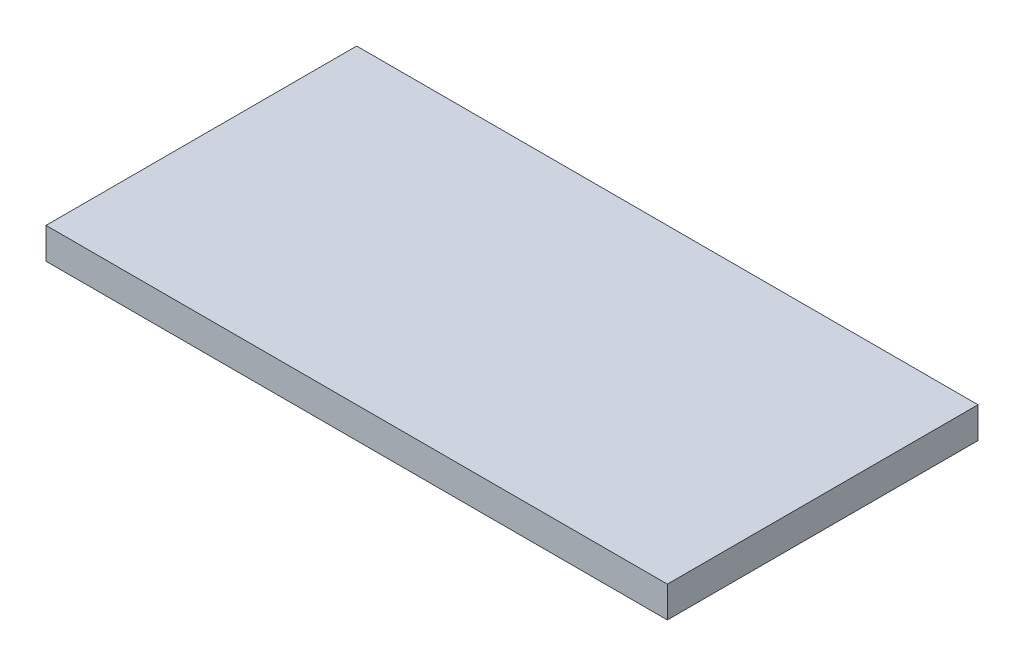
ISO-10303-21;
HEADER;
FILE_DESCRIPTION(('STEP AP214'),'2;1');
FILE_NAME('part.step','',(''),(''),'','','');
FILE_SCHEMA(('AUTOMOTIVE_DESIGN { 1 0 10303 214 1 1 1 1 }'));
ENDSEC;
DATA;
#1=APPLICATION_CONTEXT('core data for automotive mechanical design processes');
#2=APPLICATION_PROTOCOL_DEFINITION('international standard','automotive_design',2000,#1);
#3=PRODUCT_CONTEXT('',#1,'mechanical');
#4=PRODUCT('Part','Part','',(#3));
#5=PRODUCT_RELATED_PRODUCT_CATEGORY('part','',(#4));
#6=PRODUCT_DEFINITION_FORMATION('','',#4);
#7=PRODUCT_DEFINITION_CONTEXT('part definition',#1,'design');
#8=PRODUCT_DEFINITION('design','',#6,#7);
#9=PRODUCT_DEFINITION_SHAPE('','',#8);
#10=(LENGTH_UNIT() NAMED_UNIT(*) SI_UNIT(.MILLI.,.METRE.));
#11=(NAMED_UNIT(*) PLANE_ANGLE_UNIT() SI_UNIT($,.RADIAN.));
#12=(NAMED_UNIT(*) SI_UNIT($,.STERADIAN.) SOLID_ANGLE_UNIT());
#13=UNCERTAINTY_MEASURE_WITH_UNIT(LENGTH_MEASURE(1.E-05),#10,'distance_accuracy_value','');
#14=(GEOMETRIC_REPRESENTATION_CONTEXT(3) GLOBAL_UNCERTAINTY_ASSIGNED_CONTEXT((#13)) GLOBAL_UNIT_ASSIGNED_CONTEXT((#10,
#11,#12)) REPRESENTATION_CONTEXT('',''));
#15=CARTESIAN_POINT('',(0.,0.,0.));
#16=DIRECTION('',(0.,0.,1.));
#17=DIRECTION('',(1.,0.,0.));
#18=AXIS2_PLACEMENT_3D('',#15,#16,#17);
#19=CARTESIAN_POINT('',(-100.,10.,-50.));
#20=DIRECTION('',(1.,0.,0.));
#21=DIRECTION('',(0.,0.,-1.));
#22=AXIS2_PLACEMENT_3D('',#19,#20,#21);
#23=PLANE('',#22);
#24=DIRECTION('',(0.,0.,1.));
#25=VECTOR('',#24,1.);
#26=CARTESIAN_POINT('',(-100.,0.,-50.));
#27=LINE('',#26,#25);
#28=CARTESIAN_POINT('',(-100.,0.,-50.));
#29=VERTEX_POINT('',#28);
#30=CARTESIAN_POINT('',(-100.,0.,50.));
#31=VERTEX_POINT('',#30);
#32=EDGE_CURVE('E97',#29,#31,#27,.T.);
#33=ORIENTED_EDGE('',*,*,#32,.T.);
#34=DIRECTION('',(0.,-1.,0.));
#35=VECTOR('',#34,1.);
#36=CARTESIAN_POINT('',(-100.,10.,50.));
#37=LINE('',#36,#35);
#38=CARTESIAN_POINT('',(-100.,10.,50.));
#39=VERTEX_POINT('',#38);
#40=EDGE_CURVE('E11',#39,#31,#37,.T.);
#41=ORIENTED_EDGE('',*,*,#40,.F.);
#42=DIRECTION('',(0.,0.,1.));
#43=VECTOR('',#42,1.);
#44=CARTESIAN_POINT('',(-100.,10.,-50.));
#45=LINE('',#44,#43);
#46=CARTESIAN_POINT('',(-100.,10.,-50.));
#47=VERTEX_POINT('',#46);
#48=EDGE_CURVE('E85',#47,#39,#45,.T.);
#49=ORIENTED_EDGE('',*,*,#48,.F.);
#50=DIRECTION('',(0.,-1.,0.));
#51=VECTOR('',#50,1.);
#52=CARTESIAN_POINT('',(-100.,10.,-50.));
#53=LINE('',#52,#51);
#54=EDGE_CURVE('E93',#47,#29,#53,.T.);
#55=ORIENTED_EDGE('',*,*,#54,.T.);
#56=EDGE_LOOP('',(#33,#41,#49,#55));
#57=FACE_BOUND('',#56,.T.);
#58=ADVANCED_FACE('F34',(#57),#23,.F.);
#59=CARTESIAN_POINT('',(-100.,10.,50.));
#60=DIRECTION('',(0.,0.,-1.));
#61=DIRECTION('',(-1.,0.,0.));
#62=AXIS2_PLACEMENT_3D('',#59,#60,#61);
#63=PLANE('',#62);
#64=DIRECTION('',(1.,0.,0.));
#65=VECTOR('',#64,1.);
#66=CARTESIAN_POINT('',(-100.,0.,50.));
#67=LINE('',#66,#65);
#68=CARTESIAN_POINT('',(100.,0.,50.));
#69=VERTEX_POINT('',#68);
#70=EDGE_CURVE('E89',#31,#69,#67,.T.);
#71=ORIENTED_EDGE('',*,*,#70,.T.);
#72=DIRECTION('',(0.,-1.,0.));
#73=VECTOR('',#72,1.);
#74=CARTESIAN_POINT('',(100.,10.,50.));
#75=LINE('',#74,#73);
#76=CARTESIAN_POINT('',(100.,10.,50.));
#77=VERTEX_POINT('',#76);
#78=EDGE_CURVE('E42',#77,#69,#75,.T.);
#79=ORIENTED_EDGE('',*,*,#78,.F.);
#80=DIRECTION('',(1.,0.,0.));
#81=VECTOR('',#80,1.);
#82=CARTESIAN_POINT('',(-100.,10.,50.));
#83=LINE('',#82,#81);
#84=EDGE_CURVE('E80',#39,#77,#83,.T.);
#85=ORIENTED_EDGE('',*,*,#84,.F.);
#86=ORIENTED_EDGE('',*,*,#40,.T.);
#87=EDGE_LOOP('',(#71,#79,#85,#86));
#88=FACE_BOUND('',#87,.T.);
#89=ADVANCED_FACE('F88',(#88),#63,.F.);
#90=CARTESIAN_POINT('',(100.,10.,-50.));
#91=DIRECTION('',(-1.,0.,0.));
#92=DIRECTION('',(0.,0.,1.));
#93=AXIS2_PLACEMENT_3D('',#90,#91,#92);
#94=PLANE('',#93);
#95=DIRECTION('',(0.,0.,-1.));
#96=VECTOR('',#95,1.);
#97=CARTESIAN_POINT('',(100.,0.,-50.));
#98=LINE('',#97,#96);
#99=CARTESIAN_POINT('',(100.,0.,-50.));
#100=VERTEX_POINT('',#99);
#101=EDGE_CURVE('E67',#69,#100,#98,.T.);
#102=ORIENTED_EDGE('',*,*,#101,.T.);
#103=DIRECTION('',(0.,-1.,0.));
#104=VECTOR('',#103,1.);
#105=CARTESIAN_POINT('',(100.,10.,-50.));
#106=LINE('',#105,#104);
#107=CARTESIAN_POINT('',(100.,10.,-50.));
#108=VERTEX_POINT('',#107);
#109=EDGE_CURVE('E90',#108,#100,#106,.T.);
#110=ORIENTED_EDGE('',*,*,#109,.F.);
#111=DIRECTION('',(0.,0.,-1.));
#112=VECTOR('',#111,1.);
#113=CARTESIAN_POINT('',(100.,10.,-50.));
#114=LINE('',#113,#112);
#115=EDGE_CURVE('E83',#77,#108,#114,.T.);
#116=ORIENTED_EDGE('',*,*,#115,.F.);
#117=ORIENTED_EDGE('',*,*,#78,.T.);
#118=EDGE_LOOP('',(#102,#110,#116,#117));
#119=FACE_BOUND('',#118,.T.);
#120=ADVANCED_FACE('F91',(#119),#94,.F.);
#121=CARTESIAN_POINT('',(-100.,10.,-50.));
#122=DIRECTION('',(0.,0.,1.));
#123=DIRECTION('',(1.,0.,0.));
#124=AXIS2_PLACEMENT_3D('',#121,#122,#123);
#125=PLANE('',#124);
#126=DIRECTION('',(-1.,0.,0.));
#127=VECTOR('',#126,1.);
#128=CARTESIAN_POINT('',(-100.,0.,-50.));
#129=LINE('',#128,#127);
#130=EDGE_CURVE('E73',#100,#29,#129,.T.);
#131=ORIENTED_EDGE('',*,*,#130,.T.);
#132=ORIENTED_EDGE('',*,*,#54,.F.);
#133=DIRECTION('',(-1.,0.,0.));
#134=VECTOR('',#133,1.);
#135=CARTESIAN_POINT('',(-100.,10.,-50.));
#136=LINE('',#135,#134);
#137=EDGE_CURVE('E50',#108,#47,#136,.T.);
#138=ORIENTED_EDGE('',*,*,#137,.F.);
#139=ORIENTED_EDGE('',*,*,#109,.T.);
#140=EDGE_LOOP('',(#131,#132,#138,#139));
#141=FACE_BOUND('',#140,.T.);
#142=ADVANCED_FACE('F104',(#141),#125,.F.);
#143=CARTESIAN_POINT('',(0.,10.,0.));
#144=DIRECTION('',(0.,1.,0.));
#145=DIRECTION('',(0.,0.,1.));
#146=AXIS2_PLACEMENT_3D('',#143,#144,#145);
#147=PLANE('',#146);
#148=ORIENTED_EDGE('',*,*,#48,.T.);
#149=ORIENTED_EDGE('',*,*,#84,.T.);
#150=ORIENTED_EDGE('',*,*,#115,.T.);
#151=ORIENTED_EDGE('',*,*,#137,.T.);
#152=EDGE_LOOP('',(#148,#149,#150,#151));
#153=FACE_BOUND('',#152,.T.);
#154=ADVANCED_FACE('F81',(#153),#147,.T.);
#155=CARTESIAN_POINT('',(0.,0.,0.));
#156=DIRECTION('',(0.,1.,0.));
#157=DIRECTION('',(0.,0.,1.));
#158=AXIS2_PLACEMENT_3D('',#155,#156,#157);
#159=PLANE('',#158);
#160=ORIENTED_EDGE('',*,*,#32,.F.);
#161=ORIENTED_EDGE('',*,*,#130,.F.);
#162=ORIENTED_EDGE('',*,*,#101,.F.);
#163=ORIENTED_EDGE('',*,*,#70,.F.);
#164=EDGE_LOOP('',(#160,#161,#162,#163));
#165=FACE_BOUND('',#164,.T.);
#166=ADVANCED_FACE('F107',(#165),#159,.F.);
#167=CLOSED_SHELL('',(#58,#89,#120,#142,#154,#166));
#168=MANIFOLD_SOLID_BREP('B2',#167);
#169=ADVANCED_BREP_SHAPE_REPRESENTATION('',(#18,#168),#14);
#170=SHAPE_DEFINITION_REPRESENTATION(#9,#169);
ENDSEC;
END-ISO-10303-21;
